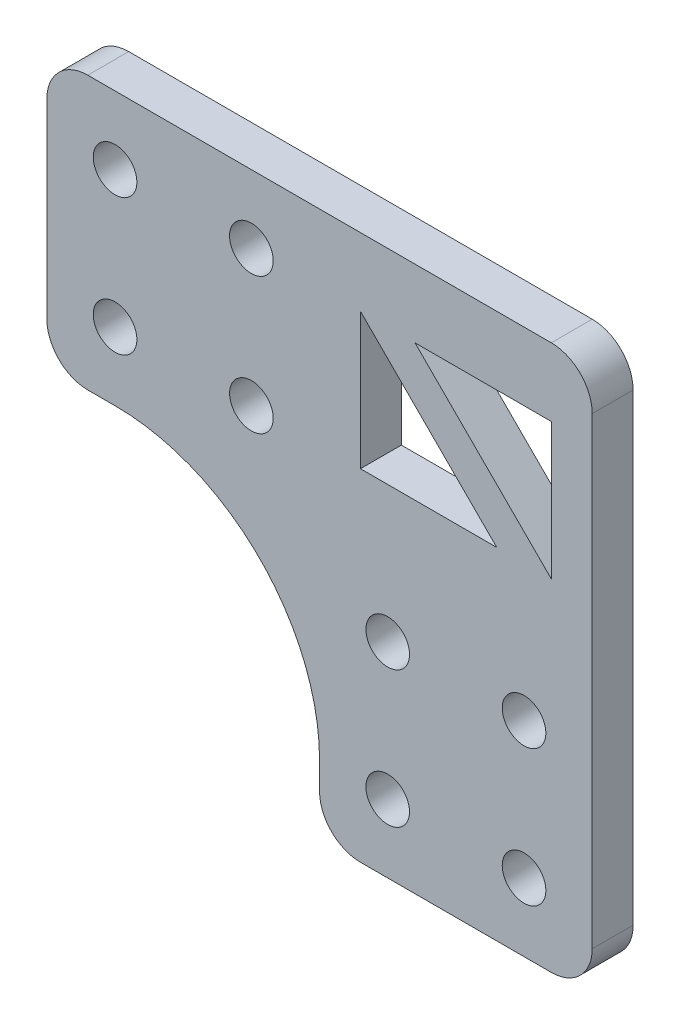
ISO-10303-21;
HEADER;
FILE_DESCRIPTION(('STEP AP214'),'2;1');
FILE_NAME('part.step','',(''),(''),'','','');
FILE_SCHEMA(('AUTOMOTIVE_DESIGN { 1 0 10303 214 1 1 1 1 }'));
ENDSEC;
DATA;
#1=APPLICATION_CONTEXT('core data for automotive mechanical design processes');
#2=APPLICATION_PROTOCOL_DEFINITION('international standard','automotive_design',2000,#1);
#3=PRODUCT_CONTEXT('',#1,'mechanical');
#4=PRODUCT('Part','Part','',(#3));
#5=PRODUCT_RELATED_PRODUCT_CATEGORY('part','',(#4));
#6=PRODUCT_DEFINITION_FORMATION('','',#4);
#7=PRODUCT_DEFINITION_CONTEXT('part definition',#1,'design');
#8=PRODUCT_DEFINITION('design','',#6,#7);
#9=PRODUCT_DEFINITION_SHAPE('','',#8);
#10=(LENGTH_UNIT() NAMED_UNIT(*) SI_UNIT(.MILLI.,.METRE.));
#11=(NAMED_UNIT(*) PLANE_ANGLE_UNIT() SI_UNIT($,.RADIAN.));
#12=(NAMED_UNIT(*) SI_UNIT($,.STERADIAN.) SOLID_ANGLE_UNIT());
#13=UNCERTAINTY_MEASURE_WITH_UNIT(LENGTH_MEASURE(1.E-05),#10,'distance_accuracy_value','');
#14=(GEOMETRIC_REPRESENTATION_CONTEXT(3) GLOBAL_UNCERTAINTY_ASSIGNED_CONTEXT((#13)) GLOBAL_UNIT_ASSIGNED_CONTEXT((#10,
#11,#12)) REPRESENTATION_CONTEXT('',''));
#15=CARTESIAN_POINT('',(0.,0.,0.));
#16=DIRECTION('',(0.,0.,1.));
#17=DIRECTION('',(1.,0.,0.));
#18=AXIS2_PLACEMENT_3D('',#15,#16,#17);
#19=CARTESIAN_POINT('',(0.,0.,3.));
#20=DIRECTION('',(0.,0.,-1.));
#21=DIRECTION('',(-1.,0.,0.));
#22=AXIS2_PLACEMENT_3D('',#19,#20,#21);
#23=PLANE('',#22);
#24=DIRECTION('',(-0.707106781186548,0.707106781186548,0.));
#25=VECTOR('',#24,1.);
#26=CARTESIAN_POINT('',(33.,-15.,3.));
#27=LINE('',#26,#25);
#28=CARTESIAN_POINT('',(33.,-15.,3.));
#29=VERTEX_POINT('',#28);
#30=CARTESIAN_POINT('',(23.,-5.,3.));
#31=VERTEX_POINT('',#30);
#32=EDGE_CURVE('E211',#29,#31,#27,.T.);
#33=ORIENTED_EDGE('',*,*,#32,.F.);
#34=DIRECTION('',(1.,0.,0.));
#35=VECTOR('',#34,1.);
#36=CARTESIAN_POINT('',(23.,-15.,3.));
#37=LINE('',#36,#35);
#38=CARTESIAN_POINT('',(23.,-15.,3.));
#39=VERTEX_POINT('',#38);
#40=EDGE_CURVE('E219',#39,#29,#37,.T.);
#41=ORIENTED_EDGE('',*,*,#40,.F.);
#42=DIRECTION('',(0.,-1.,0.));
#43=VECTOR('',#42,1.);
#44=CARTESIAN_POINT('',(23.,-5.,3.));
#45=LINE('',#44,#43);
#46=EDGE_CURVE('E214',#31,#39,#45,.T.);
#47=ORIENTED_EDGE('',*,*,#46,.F.);
#48=EDGE_LOOP('',(#33,#41,#47));
#49=FACE_BOUND('',#48,.T.);
#50=DIRECTION('',(1.,0.,0.));
#51=VECTOR('',#50,1.);
#52=CARTESIAN_POINT('',(40.,-40.,3.));
#53=LINE('',#52,#51);
#54=CARTESIAN_POINT('',(23.,-40.,3.));
#55=VERTEX_POINT('',#54);
#56=CARTESIAN_POINT('',(37.,-40.,3.));
#57=VERTEX_POINT('',#56);
#58=EDGE_CURVE('E319',#55,#57,#53,.T.);
#59=ORIENTED_EDGE('',*,*,#58,.T.);
#60=CARTESIAN_POINT('',(37.,-37.,3.));
#61=DIRECTION('',(0.,0.,-1.));
#62=DIRECTION('',(-1.,0.,0.));
#63=AXIS2_PLACEMENT_3D('',#60,#61,#62);
#64=CIRCLE('',#63,3.);
#65=CARTESIAN_POINT('',(40.,-37.,3.));
#66=VERTEX_POINT('',#65);
#67=EDGE_CURVE('E393',#57,#66,#64,.F.);
#68=ORIENTED_EDGE('',*,*,#67,.T.);
#69=DIRECTION('',(0.,1.,0.));
#70=VECTOR('',#69,1.);
#71=CARTESIAN_POINT('',(40.,0.,3.));
#72=LINE('',#71,#70);
#73=CARTESIAN_POINT('',(40.,-3.,3.));
#74=VERTEX_POINT('',#73);
#75=EDGE_CURVE('E323',#66,#74,#72,.T.);
#76=ORIENTED_EDGE('',*,*,#75,.T.);
#77=CARTESIAN_POINT('',(37.,-3.,3.));
#78=DIRECTION('',(0.,0.,-1.));
#79=DIRECTION('',(-1.,0.,0.));
#80=AXIS2_PLACEMENT_3D('',#77,#78,#79);
#81=CIRCLE('',#80,3.);
#82=CARTESIAN_POINT('',(37.,0.,3.));
#83=VERTEX_POINT('',#82);
#84=EDGE_CURVE('E390',#74,#83,#81,.F.);
#85=ORIENTED_EDGE('',*,*,#84,.T.);
#86=DIRECTION('',(-1.,0.,0.));
#87=VECTOR('',#86,1.);
#88=CARTESIAN_POINT('',(0.,0.,3.));
#89=LINE('',#88,#87);
#90=CARTESIAN_POINT('',(3.,0.,3.));
#91=VERTEX_POINT('',#90);
#92=EDGE_CURVE('E327',#83,#91,#89,.T.);
#93=ORIENTED_EDGE('',*,*,#92,.T.);
#94=CARTESIAN_POINT('',(3.,-3.,3.));
#95=DIRECTION('',(0.,0.,-1.));
#96=DIRECTION('',(-1.,0.,0.));
#97=AXIS2_PLACEMENT_3D('',#94,#95,#96);
#98=CIRCLE('',#97,3.);
#99=CARTESIAN_POINT('',(0.,-3.,3.));
#100=VERTEX_POINT('',#99);
#101=EDGE_CURVE('E381',#91,#100,#98,.F.);
#102=ORIENTED_EDGE('',*,*,#101,.T.);
#103=DIRECTION('',(0.,-1.,0.));
#104=VECTOR('',#103,1.);
#105=CARTESIAN_POINT('',(0.,-20.,3.));
#106=LINE('',#105,#104);
#107=CARTESIAN_POINT('',(0.,-17.,3.));
#108=VERTEX_POINT('',#107);
#109=EDGE_CURVE('E308',#100,#108,#106,.T.);
#110=ORIENTED_EDGE('',*,*,#109,.T.);
#111=CARTESIAN_POINT('',(3.,-17.,3.));
#112=DIRECTION('',(0.,0.,-1.));
#113=DIRECTION('',(-1.,0.,0.));
#114=AXIS2_PLACEMENT_3D('',#111,#112,#113);
#115=CIRCLE('',#114,3.);
#116=CARTESIAN_POINT('',(3.,-20.,3.));
#117=VERTEX_POINT('',#116);
#118=EDGE_CURVE('E384',#108,#117,#115,.F.);
#119=ORIENTED_EDGE('',*,*,#118,.T.);
#120=DIRECTION('',(1.,0.,0.));
#121=VECTOR('',#120,1.);
#122=CARTESIAN_POINT('',(0.,-20.,3.));
#123=LINE('',#122,#121);
#124=CARTESIAN_POINT('',(5.00000000000001,-20.,3.));
#125=VERTEX_POINT('',#124);
#126=EDGE_CURVE('E312',#117,#125,#123,.T.);
#127=ORIENTED_EDGE('',*,*,#126,.T.);
#128=CARTESIAN_POINT('',(5.00000000000001,-35.,3.));
#129=DIRECTION('',(0.,0.,-1.));
#130=DIRECTION('',(-1.,0.,0.));
#131=AXIS2_PLACEMENT_3D('',#128,#129,#130);
#132=CIRCLE('',#131,15.);
#133=CARTESIAN_POINT('',(20.,-35.,3.));
#134=VERTEX_POINT('',#133);
#135=EDGE_CURVE('E11',#125,#134,#132,.T.);
#136=ORIENTED_EDGE('',*,*,#135,.T.);
#137=DIRECTION('',(0.,-1.,0.));
#138=VECTOR('',#137,1.);
#139=CARTESIAN_POINT('',(20.,-20.,3.));
#140=LINE('',#139,#138);
#141=CARTESIAN_POINT('',(20.,-37.,3.));
#142=VERTEX_POINT('',#141);
#143=EDGE_CURVE('E316',#134,#142,#140,.T.);
#144=ORIENTED_EDGE('',*,*,#143,.T.);
#145=CARTESIAN_POINT('',(23.,-37.,3.));
#146=DIRECTION('',(0.,0.,-1.));
#147=DIRECTION('',(-1.,0.,0.));
#148=AXIS2_PLACEMENT_3D('',#145,#146,#147);
#149=CIRCLE('',#148,3.);
#150=EDGE_CURVE('E387',#142,#55,#149,.F.);
#151=ORIENTED_EDGE('',*,*,#150,.T.);
#152=EDGE_LOOP('',(#59,#68,#76,#85,#93,#102,#110,#119,#127,#136,#144,#151));
#153=FACE_BOUND('',#152,.T.);
#154=CARTESIAN_POINT('',(5.,-5.,3.));
#155=DIRECTION('',(0.,0.,1.));
#156=DIRECTION('',(1.,0.,0.));
#157=AXIS2_PLACEMENT_3D('',#154,#155,#156);
#158=CIRCLE('',#157,1.6);
#159=CARTESIAN_POINT('',(6.6,-5.,3.));
#160=VERTEX_POINT('',#159);
#161=EDGE_CURVE('E300',#160,#160,#158,.T.);
#162=ORIENTED_EDGE('',*,*,#161,.F.);
#163=EDGE_LOOP('',(#162));
#164=FACE_BOUND('',#163,.T.);
#165=CARTESIAN_POINT('',(15.,-5.,3.));
#166=DIRECTION('',(0.,0.,1.));
#167=DIRECTION('',(-1.,0.,0.));
#168=AXIS2_PLACEMENT_3D('',#165,#166,#167);
#169=CIRCLE('',#168,1.6);
#170=CARTESIAN_POINT('',(13.4,-5.,3.));
#171=VERTEX_POINT('',#170);
#172=EDGE_CURVE('E292',#171,#171,#169,.T.);
#173=ORIENTED_EDGE('',*,*,#172,.F.);
#174=EDGE_LOOP('',(#173));
#175=FACE_BOUND('',#174,.T.);
#176=CARTESIAN_POINT('',(15.,-15.,3.));
#177=DIRECTION('',(0.,0.,1.));
#178=DIRECTION('',(1.,0.,0.));
#179=AXIS2_PLACEMENT_3D('',#176,#177,#178);
#180=CIRCLE('',#179,1.6);
#181=CARTESIAN_POINT('',(16.6,-15.,3.));
#182=VERTEX_POINT('',#181);
#183=EDGE_CURVE('E284',#182,#182,#180,.T.);
#184=ORIENTED_EDGE('',*,*,#183,.F.);
#185=EDGE_LOOP('',(#184));
#186=FACE_BOUND('',#185,.T.);
#187=CARTESIAN_POINT('',(5.,-15.,3.));
#188=DIRECTION('',(0.,0.,1.));
#189=DIRECTION('',(-1.,0.,0.));
#190=AXIS2_PLACEMENT_3D('',#187,#188,#189);
#191=CIRCLE('',#190,1.6);
#192=CARTESIAN_POINT('',(3.4,-15.,3.));
#193=VERTEX_POINT('',#192);
#194=EDGE_CURVE('E276',#193,#193,#191,.T.);
#195=ORIENTED_EDGE('',*,*,#194,.F.);
#196=EDGE_LOOP('',(#195));
#197=FACE_BOUND('',#196,.T.);
#198=CARTESIAN_POINT('',(25.,-35.,3.));
#199=DIRECTION('',(0.,0.,1.));
#200=DIRECTION('',(1.,0.,0.));
#201=AXIS2_PLACEMENT_3D('',#198,#199,#200);
#202=CIRCLE('',#201,1.6);
#203=CARTESIAN_POINT('',(26.6,-35.,3.));
#204=VERTEX_POINT('',#203);
#205=EDGE_CURVE('E268',#204,#204,#202,.T.);
#206=ORIENTED_EDGE('',*,*,#205,.F.);
#207=EDGE_LOOP('',(#206));
#208=FACE_BOUND('',#207,.T.);
#209=CARTESIAN_POINT('',(35.,-35.,3.));
#210=DIRECTION('',(0.,0.,1.));
#211=DIRECTION('',(-1.,0.,0.));
#212=AXIS2_PLACEMENT_3D('',#209,#210,#211);
#213=CIRCLE('',#212,1.60000000000001);
#214=CARTESIAN_POINT('',(33.4,-35.,3.));
#215=VERTEX_POINT('',#214);
#216=EDGE_CURVE('E260',#215,#215,#213,.T.);
#217=ORIENTED_EDGE('',*,*,#216,.F.);
#218=EDGE_LOOP('',(#217));
#219=FACE_BOUND('',#218,.T.);
#220=CARTESIAN_POINT('',(35.,-25.,3.));
#221=DIRECTION('',(0.,0.,1.));
#222=DIRECTION('',(1.,0.,0.));
#223=AXIS2_PLACEMENT_3D('',#220,#221,#222);
#224=CIRCLE('',#223,1.6);
#225=CARTESIAN_POINT('',(36.6,-25.,3.));
#226=VERTEX_POINT('',#225);
#227=EDGE_CURVE('E252',#226,#226,#224,.T.);
#228=ORIENTED_EDGE('',*,*,#227,.F.);
#229=EDGE_LOOP('',(#228));
#230=FACE_BOUND('',#229,.T.);
#231=CARTESIAN_POINT('',(25.,-25.,3.));
#232=DIRECTION('',(0.,0.,1.));
#233=DIRECTION('',(-1.,0.,0.));
#234=AXIS2_PLACEMENT_3D('',#231,#232,#233);
#235=CIRCLE('',#234,1.6);
#236=CARTESIAN_POINT('',(23.4,-25.,3.));
#237=VERTEX_POINT('',#236);
#238=EDGE_CURVE('E244',#237,#237,#235,.T.);
#239=ORIENTED_EDGE('',*,*,#238,.F.);
#240=EDGE_LOOP('',(#239));
#241=FACE_BOUND('',#240,.T.);
#242=DIRECTION('',(0.707106781186547,-0.707106781186548,0.));
#243=VECTOR('',#242,1.);
#244=CARTESIAN_POINT('',(37.,-15.,3.));
#245=LINE('',#244,#243);
#246=CARTESIAN_POINT('',(27.,-5.,3.));
#247=VERTEX_POINT('',#246);
#248=CARTESIAN_POINT('',(37.,-15.,3.));
#249=VERTEX_POINT('',#248);
#250=EDGE_CURVE('E170',#247,#249,#245,.T.);
#251=ORIENTED_EDGE('',*,*,#250,.F.);
#252=DIRECTION('',(-1.,0.,0.));
#253=VECTOR('',#252,1.);
#254=CARTESIAN_POINT('',(27.,-5.,3.));
#255=LINE('',#254,#253);
#256=CARTESIAN_POINT('',(37.,-5.,3.));
#257=VERTEX_POINT('',#256);
#258=EDGE_CURVE('E193',#257,#247,#255,.T.);
#259=ORIENTED_EDGE('',*,*,#258,.F.);
#260=DIRECTION('',(0.,1.,0.));
#261=VECTOR('',#260,1.);
#262=CARTESIAN_POINT('',(37.,-5.,3.));
#263=LINE('',#262,#261);
#264=EDGE_CURVE('E181',#249,#257,#263,.T.);
#265=ORIENTED_EDGE('',*,*,#264,.F.);
#266=EDGE_LOOP('',(#251,#259,#265));
#267=FACE_BOUND('',#266,.T.);
#268=ADVANCED_FACE('F43',(#49,#153,#164,#175,#186,#197,#208,#219,#230,#241,#267),#23,.F.);
#269=CARTESIAN_POINT('',(0.,0.,0.));
#270=DIRECTION('',(0.,0.,-1.));
#271=DIRECTION('',(-1.,0.,0.));
#272=AXIS2_PLACEMENT_3D('',#269,#270,#271);
#273=PLANE('',#272);
#274=CARTESIAN_POINT('',(35.,-25.,0.));
#275=DIRECTION('',(0.,0.,1.));
#276=DIRECTION('',(1.,0.,0.));
#277=AXIS2_PLACEMENT_3D('',#274,#275,#276);
#278=CIRCLE('',#277,1.6);
#279=CARTESIAN_POINT('',(36.6,-25.,0.));
#280=VERTEX_POINT('',#279);
#281=EDGE_CURVE('E248',#280,#280,#278,.T.);
#282=ORIENTED_EDGE('',*,*,#281,.T.);
#283=EDGE_LOOP('',(#282));
#284=FACE_BOUND('',#283,.T.);
#285=CARTESIAN_POINT('',(25.,-35.,0.));
#286=DIRECTION('',(0.,0.,1.));
#287=DIRECTION('',(1.,0.,0.));
#288=AXIS2_PLACEMENT_3D('',#285,#286,#287);
#289=CIRCLE('',#288,1.6);
#290=CARTESIAN_POINT('',(26.6,-35.,0.));
#291=VERTEX_POINT('',#290);
#292=EDGE_CURVE('E264',#291,#291,#289,.T.);
#293=ORIENTED_EDGE('',*,*,#292,.T.);
#294=EDGE_LOOP('',(#293));
#295=FACE_BOUND('',#294,.T.);
#296=CARTESIAN_POINT('',(15.,-15.,0.));
#297=DIRECTION('',(0.,0.,1.));
#298=DIRECTION('',(1.,0.,0.));
#299=AXIS2_PLACEMENT_3D('',#296,#297,#298);
#300=CIRCLE('',#299,1.6);
#301=CARTESIAN_POINT('',(16.6,-15.,0.));
#302=VERTEX_POINT('',#301);
#303=EDGE_CURVE('E280',#302,#302,#300,.T.);
#304=ORIENTED_EDGE('',*,*,#303,.T.);
#305=EDGE_LOOP('',(#304));
#306=FACE_BOUND('',#305,.T.);
#307=CARTESIAN_POINT('',(5.,-5.,0.));
#308=DIRECTION('',(0.,0.,1.));
#309=DIRECTION('',(1.,0.,0.));
#310=AXIS2_PLACEMENT_3D('',#307,#308,#309);
#311=CIRCLE('',#310,1.6);
#312=CARTESIAN_POINT('',(6.6,-5.,0.));
#313=VERTEX_POINT('',#312);
#314=EDGE_CURVE('E296',#313,#313,#311,.T.);
#315=ORIENTED_EDGE('',*,*,#314,.T.);
#316=EDGE_LOOP('',(#315));
#317=FACE_BOUND('',#316,.T.);
#318=DIRECTION('',(0.,1.,0.));
#319=VECTOR('',#318,1.);
#320=CARTESIAN_POINT('',(40.,0.,0.));
#321=LINE('',#320,#319);
#322=CARTESIAN_POINT('',(40.,-37.,0.));
#323=VERTEX_POINT('',#322);
#324=CARTESIAN_POINT('',(40.,-3.,0.));
#325=VERTEX_POINT('',#324);
#326=EDGE_CURVE('E345',#323,#325,#321,.T.);
#327=ORIENTED_EDGE('',*,*,#326,.F.);
#328=CARTESIAN_POINT('',(37.,-37.,0.));
#329=DIRECTION('',(0.,0.,-1.));
#330=DIRECTION('',(-1.,0.,0.));
#331=AXIS2_PLACEMENT_3D('',#328,#329,#330);
#332=CIRCLE('',#331,3.);
#333=CARTESIAN_POINT('',(37.,-40.,0.));
#334=VERTEX_POINT('',#333);
#335=EDGE_CURVE('E371',#323,#334,#332,.T.);
#336=ORIENTED_EDGE('',*,*,#335,.T.);
#337=DIRECTION('',(1.,0.,0.));
#338=VECTOR('',#337,1.);
#339=CARTESIAN_POINT('',(40.,-40.,0.));
#340=LINE('',#339,#338);
#341=CARTESIAN_POINT('',(23.,-40.,0.));
#342=VERTEX_POINT('',#341);
#343=EDGE_CURVE('E341',#342,#334,#340,.T.);
#344=ORIENTED_EDGE('',*,*,#343,.F.);
#345=CARTESIAN_POINT('',(23.,-37.,0.));
#346=DIRECTION('',(0.,0.,-1.));
#347=DIRECTION('',(-1.,0.,0.));
#348=AXIS2_PLACEMENT_3D('',#345,#346,#347);
#349=CIRCLE('',#348,3.);
#350=CARTESIAN_POINT('',(20.,-37.,0.));
#351=VERTEX_POINT('',#350);
#352=EDGE_CURVE('E364',#342,#351,#349,.T.);
#353=ORIENTED_EDGE('',*,*,#352,.T.);
#354=DIRECTION('',(0.,-1.,0.));
#355=VECTOR('',#354,1.);
#356=CARTESIAN_POINT('',(20.,-20.,0.));
#357=LINE('',#356,#355);
#358=CARTESIAN_POINT('',(20.,-35.,0.));
#359=VERTEX_POINT('',#358);
#360=EDGE_CURVE('E338',#359,#351,#357,.T.);
#361=ORIENTED_EDGE('',*,*,#360,.F.);
#362=CARTESIAN_POINT('',(5.00000000000001,-35.,0.));
#363=DIRECTION('',(0.,0.,-1.));
#364=DIRECTION('',(-1.,0.,0.));
#365=AXIS2_PLACEMENT_3D('',#362,#363,#364);
#366=CIRCLE('',#365,15.);
#367=CARTESIAN_POINT('',(5.00000000000001,-20.,0.));
#368=VERTEX_POINT('',#367);
#369=EDGE_CURVE('E52',#359,#368,#366,.F.);
#370=ORIENTED_EDGE('',*,*,#369,.T.);
#371=DIRECTION('',(1.,0.,0.));
#372=VECTOR('',#371,1.);
#373=CARTESIAN_POINT('',(0.,-20.,0.));
#374=LINE('',#373,#372);
#375=CARTESIAN_POINT('',(3.,-20.,0.));
#376=VERTEX_POINT('',#375);
#377=EDGE_CURVE('E335',#376,#368,#374,.T.);
#378=ORIENTED_EDGE('',*,*,#377,.F.);
#379=CARTESIAN_POINT('',(3.,-17.,0.));
#380=DIRECTION('',(0.,0.,-1.));
#381=DIRECTION('',(-1.,0.,0.));
#382=AXIS2_PLACEMENT_3D('',#379,#380,#381);
#383=CIRCLE('',#382,3.);
#384=CARTESIAN_POINT('',(0.,-17.,0.));
#385=VERTEX_POINT('',#384);
#386=EDGE_CURVE('E361',#376,#385,#383,.T.);
#387=ORIENTED_EDGE('',*,*,#386,.T.);
#388=DIRECTION('',(0.,-1.,0.));
#389=VECTOR('',#388,1.);
#390=CARTESIAN_POINT('',(0.,-20.,0.));
#391=LINE('',#390,#389);
#392=CARTESIAN_POINT('',(0.,-3.,0.));
#393=VERTEX_POINT('',#392);
#394=EDGE_CURVE('E304',#393,#385,#391,.T.);
#395=ORIENTED_EDGE('',*,*,#394,.F.);
#396=CARTESIAN_POINT('',(3.,-3.,0.));
#397=DIRECTION('',(0.,0.,-1.));
#398=DIRECTION('',(-1.,0.,0.));
#399=AXIS2_PLACEMENT_3D('',#396,#397,#398);
#400=CIRCLE('',#399,3.);
#401=CARTESIAN_POINT('',(3.,0.,0.));
#402=VERTEX_POINT('',#401);
#403=EDGE_CURVE('E358',#393,#402,#400,.T.);
#404=ORIENTED_EDGE('',*,*,#403,.T.);
#405=DIRECTION('',(-1.,0.,0.));
#406=VECTOR('',#405,1.);
#407=CARTESIAN_POINT('',(0.,0.,0.));
#408=LINE('',#407,#406);
#409=CARTESIAN_POINT('',(37.,0.,0.));
#410=VERTEX_POINT('',#409);
#411=EDGE_CURVE('E313',#410,#402,#408,.T.);
#412=ORIENTED_EDGE('',*,*,#411,.F.);
#413=CARTESIAN_POINT('',(37.,-3.,0.));
#414=DIRECTION('',(0.,0.,-1.));
#415=DIRECTION('',(-1.,0.,0.));
#416=AXIS2_PLACEMENT_3D('',#413,#414,#415);
#417=CIRCLE('',#416,3.);
#418=EDGE_CURVE('E368',#410,#325,#417,.T.);
#419=ORIENTED_EDGE('',*,*,#418,.T.);
#420=EDGE_LOOP('',(#327,#336,#344,#353,#361,#370,#378,#387,#395,#404,#412,#419));
#421=FACE_BOUND('',#420,.T.);
#422=CARTESIAN_POINT('',(15.,-5.,0.));
#423=DIRECTION('',(0.,0.,1.));
#424=DIRECTION('',(-1.,0.,0.));
#425=AXIS2_PLACEMENT_3D('',#422,#423,#424);
#426=CIRCLE('',#425,1.6);
#427=CARTESIAN_POINT('',(13.4,-5.,0.));
#428=VERTEX_POINT('',#427);
#429=EDGE_CURVE('E288',#428,#428,#426,.T.);
#430=ORIENTED_EDGE('',*,*,#429,.T.);
#431=EDGE_LOOP('',(#430));
#432=FACE_BOUND('',#431,.T.);
#433=CARTESIAN_POINT('',(5.,-15.,0.));
#434=DIRECTION('',(0.,0.,1.));
#435=DIRECTION('',(-1.,0.,0.));
#436=AXIS2_PLACEMENT_3D('',#433,#434,#435);
#437=CIRCLE('',#436,1.6);
#438=CARTESIAN_POINT('',(3.4,-15.,0.));
#439=VERTEX_POINT('',#438);
#440=EDGE_CURVE('E272',#439,#439,#437,.T.);
#441=ORIENTED_EDGE('',*,*,#440,.T.);
#442=EDGE_LOOP('',(#441));
#443=FACE_BOUND('',#442,.T.);
#444=CARTESIAN_POINT('',(35.,-35.,0.));
#445=DIRECTION('',(0.,0.,1.));
#446=DIRECTION('',(-1.,0.,0.));
#447=AXIS2_PLACEMENT_3D('',#444,#445,#446);
#448=CIRCLE('',#447,1.60000000000001);
#449=CARTESIAN_POINT('',(33.4,-35.,0.));
#450=VERTEX_POINT('',#449);
#451=EDGE_CURVE('E256',#450,#450,#448,.T.);
#452=ORIENTED_EDGE('',*,*,#451,.T.);
#453=EDGE_LOOP('',(#452));
#454=FACE_BOUND('',#453,.T.);
#455=CARTESIAN_POINT('',(25.,-25.,0.));
#456=DIRECTION('',(0.,0.,1.));
#457=DIRECTION('',(-1.,0.,0.));
#458=AXIS2_PLACEMENT_3D('',#455,#456,#457);
#459=CIRCLE('',#458,1.6);
#460=CARTESIAN_POINT('',(23.4,-25.,0.));
#461=VERTEX_POINT('',#460);
#462=EDGE_CURVE('E243',#461,#461,#459,.T.);
#463=ORIENTED_EDGE('',*,*,#462,.T.);
#464=EDGE_LOOP('',(#463));
#465=FACE_BOUND('',#464,.T.);
#466=DIRECTION('',(1.,0.,0.));
#467=VECTOR('',#466,1.);
#468=CARTESIAN_POINT('',(23.,-15.,0.));
#469=LINE('',#468,#467);
#470=CARTESIAN_POINT('',(23.,-15.,0.));
#471=VERTEX_POINT('',#470);
#472=CARTESIAN_POINT('',(33.,-15.,0.));
#473=VERTEX_POINT('',#472);
#474=EDGE_CURVE('E215',#471,#473,#469,.T.);
#475=ORIENTED_EDGE('',*,*,#474,.T.);
#476=DIRECTION('',(-0.707106781186548,0.707106781186548,0.));
#477=VECTOR('',#476,1.);
#478=CARTESIAN_POINT('',(33.,-15.,0.));
#479=LINE('',#478,#477);
#480=CARTESIAN_POINT('',(23.,-5.,0.));
#481=VERTEX_POINT('',#480);
#482=EDGE_CURVE('E190',#473,#481,#479,.T.);
#483=ORIENTED_EDGE('',*,*,#482,.T.);
#484=DIRECTION('',(0.,-1.,0.));
#485=VECTOR('',#484,1.);
#486=CARTESIAN_POINT('',(23.,-5.,0.));
#487=LINE('',#486,#485);
#488=EDGE_CURVE('E226',#481,#471,#487,.T.);
#489=ORIENTED_EDGE('',*,*,#488,.T.);
#490=EDGE_LOOP('',(#475,#483,#489));
#491=FACE_BOUND('',#490,.T.);
#492=DIRECTION('',(-1.,0.,0.));
#493=VECTOR('',#492,1.);
#494=CARTESIAN_POINT('',(27.,-5.,0.));
#495=LINE('',#494,#493);
#496=CARTESIAN_POINT('',(37.,-5.,0.));
#497=VERTEX_POINT('',#496);
#498=CARTESIAN_POINT('',(27.,-5.,0.));
#499=VERTEX_POINT('',#498);
#500=EDGE_CURVE('E182',#497,#499,#495,.T.);
#501=ORIENTED_EDGE('',*,*,#500,.T.);
#502=DIRECTION('',(0.707106781186547,-0.707106781186548,0.));
#503=VECTOR('',#502,1.);
#504=CARTESIAN_POINT('',(37.,-15.,0.));
#505=LINE('',#504,#503);
#506=CARTESIAN_POINT('',(37.,-15.,0.));
#507=VERTEX_POINT('',#506);
#508=EDGE_CURVE('E199',#499,#507,#505,.T.);
#509=ORIENTED_EDGE('',*,*,#508,.T.);
#510=DIRECTION('',(0.,1.,0.));
#511=VECTOR('',#510,1.);
#512=CARTESIAN_POINT('',(37.,-5.,0.));
#513=LINE('',#512,#511);
#514=EDGE_CURVE('E188',#507,#497,#513,.T.);
#515=ORIENTED_EDGE('',*,*,#514,.T.);
#516=EDGE_LOOP('',(#501,#509,#515));
#517=FACE_BOUND('',#516,.T.);
#518=ADVANCED_FACE('F431',(#284,#295,#306,#317,#421,#432,#443,#454,#465,#491,#517),#273,.T.);
#519=CARTESIAN_POINT('',(0.,-20.,3.));
#520=DIRECTION('',(1.,0.,0.));
#521=DIRECTION('',(0.,0.,-1.));
#522=AXIS2_PLACEMENT_3D('',#519,#520,#521);
#523=PLANE('',#522);
#524=ORIENTED_EDGE('',*,*,#394,.T.);
#525=DIRECTION('',(0.,0.,-1.));
#526=VECTOR('',#525,1.);
#527=CARTESIAN_POINT('',(0.,-17.,3.));
#528=LINE('',#527,#526);
#529=EDGE_CURVE('E415',#385,#108,#528,.F.);
#530=ORIENTED_EDGE('',*,*,#529,.T.);
#531=ORIENTED_EDGE('',*,*,#109,.F.);
#532=DIRECTION('',(0.,0.,-1.));
#533=VECTOR('',#532,1.);
#534=CARTESIAN_POINT('',(0.,-3.,3.));
#535=LINE('',#534,#533);
#536=EDGE_CURVE('E411',#100,#393,#535,.T.);
#537=ORIENTED_EDGE('',*,*,#536,.T.);
#538=EDGE_LOOP('',(#524,#530,#531,#537));
#539=FACE_BOUND('',#538,.T.);
#540=ADVANCED_FACE('F469',(#539),#523,.F.);
#541=CARTESIAN_POINT('',(0.,-20.,3.));
#542=DIRECTION('',(0.,1.,0.));
#543=DIRECTION('',(0.,0.,1.));
#544=AXIS2_PLACEMENT_3D('',#541,#542,#543);
#545=PLANE('',#544);
#546=ORIENTED_EDGE('',*,*,#377,.T.);
#547=DIRECTION('',(0.,0.,-1.));
#548=VECTOR('',#547,1.);
#549=CARTESIAN_POINT('',(5.00000000000001,-20.,3.));
#550=LINE('',#549,#548);
#551=EDGE_CURVE('E65',#368,#125,#550,.F.);
#552=ORIENTED_EDGE('',*,*,#551,.T.);
#553=ORIENTED_EDGE('',*,*,#126,.F.);
#554=DIRECTION('',(0.,0.,-1.));
#555=VECTOR('',#554,1.);
#556=CARTESIAN_POINT('',(3.,-20.,3.));
#557=LINE('',#556,#555);
#558=EDGE_CURVE('E407',#117,#376,#557,.T.);
#559=ORIENTED_EDGE('',*,*,#558,.T.);
#560=EDGE_LOOP('',(#546,#552,#553,#559));
#561=FACE_BOUND('',#560,.T.);
#562=ADVANCED_FACE('F475',(#561),#545,.F.);
#563=CARTESIAN_POINT('',(20.,-20.,3.));
#564=DIRECTION('',(1.,0.,0.));
#565=DIRECTION('',(0.,0.,-1.));
#566=AXIS2_PLACEMENT_3D('',#563,#564,#565);
#567=PLANE('',#566);
#568=ORIENTED_EDGE('',*,*,#143,.F.);
#569=DIRECTION('',(0.,0.,-1.));
#570=VECTOR('',#569,1.);
#571=CARTESIAN_POINT('',(20.,-35.,0.));
#572=LINE('',#571,#570);
#573=EDGE_CURVE('E418',#134,#359,#572,.T.);
#574=ORIENTED_EDGE('',*,*,#573,.T.);
#575=ORIENTED_EDGE('',*,*,#360,.T.);
#576=DIRECTION('',(0.,0.,-1.));
#577=VECTOR('',#576,1.);
#578=CARTESIAN_POINT('',(20.,-37.,3.));
#579=LINE('',#578,#577);
#580=EDGE_CURVE('E403',#351,#142,#579,.F.);
#581=ORIENTED_EDGE('',*,*,#580,.T.);
#582=EDGE_LOOP('',(#568,#574,#575,#581));
#583=FACE_BOUND('',#582,.T.);
#584=ADVANCED_FACE('F427',(#583),#567,.F.);
#585=CARTESIAN_POINT('',(40.,-40.,3.));
#586=DIRECTION('',(0.,1.,0.));
#587=DIRECTION('',(-1.,0.,0.));
#588=AXIS2_PLACEMENT_3D('',#585,#586,#587);
#589=PLANE('',#588);
#590=ORIENTED_EDGE('',*,*,#343,.T.);
#591=DIRECTION('',(0.,0.,-1.));
#592=VECTOR('',#591,1.);
#593=CARTESIAN_POINT('',(37.,-40.,3.));
#594=LINE('',#593,#592);
#595=EDGE_CURVE('E378',#334,#57,#594,.F.);
#596=ORIENTED_EDGE('',*,*,#595,.T.);
#597=ORIENTED_EDGE('',*,*,#58,.F.);
#598=DIRECTION('',(0.,0.,-1.));
#599=VECTOR('',#598,1.);
#600=CARTESIAN_POINT('',(23.,-40.,3.));
#601=LINE('',#600,#599);
#602=EDGE_CURVE('E374',#55,#342,#601,.T.);
#603=ORIENTED_EDGE('',*,*,#602,.T.);
#604=EDGE_LOOP('',(#590,#596,#597,#603));
#605=FACE_BOUND('',#604,.T.);
#606=ADVANCED_FACE('F444',(#605),#589,.F.);
#607=CARTESIAN_POINT('',(40.,0.,3.));
#608=DIRECTION('',(-1.,0.,0.));
#609=DIRECTION('',(0.,-1.,0.));
#610=AXIS2_PLACEMENT_3D('',#607,#608,#609);
#611=PLANE('',#610);
#612=ORIENTED_EDGE('',*,*,#75,.F.);
#613=DIRECTION('',(0.,0.,-1.));
#614=VECTOR('',#613,1.);
#615=CARTESIAN_POINT('',(40.,-37.,3.));
#616=LINE('',#615,#614);
#617=EDGE_CURVE('E354',#66,#323,#616,.T.);
#618=ORIENTED_EDGE('',*,*,#617,.T.);
#619=ORIENTED_EDGE('',*,*,#326,.T.);
#620=DIRECTION('',(0.,0.,-1.));
#621=VECTOR('',#620,1.);
#622=CARTESIAN_POINT('',(40.,-3.,3.));
#623=LINE('',#622,#621);
#624=EDGE_CURVE('E331',#325,#74,#623,.F.);
#625=ORIENTED_EDGE('',*,*,#624,.T.);
#626=EDGE_LOOP('',(#612,#618,#619,#625));
#627=FACE_BOUND('',#626,.T.);
#628=ADVANCED_FACE('F452',(#627),#611,.F.);
#629=CARTESIAN_POINT('',(0.,0.,3.));
#630=DIRECTION('',(0.,-1.,0.));
#631=DIRECTION('',(0.,0.,-1.));
#632=AXIS2_PLACEMENT_3D('',#629,#630,#631);
#633=PLANE('',#632);
#634=ORIENTED_EDGE('',*,*,#92,.F.);
#635=DIRECTION('',(0.,0.,-1.));
#636=VECTOR('',#635,1.);
#637=CARTESIAN_POINT('',(37.,0.,3.));
#638=LINE('',#637,#636);
#639=EDGE_CURVE('E399',#83,#410,#638,.T.);
#640=ORIENTED_EDGE('',*,*,#639,.T.);
#641=ORIENTED_EDGE('',*,*,#411,.T.);
#642=DIRECTION('',(0.,0.,-1.));
#643=VECTOR('',#642,1.);
#644=CARTESIAN_POINT('',(3.,0.,3.));
#645=LINE('',#644,#643);
#646=EDGE_CURVE('E396',#402,#91,#645,.F.);
#647=ORIENTED_EDGE('',*,*,#646,.T.);
#648=EDGE_LOOP('',(#634,#640,#641,#647));
#649=FACE_BOUND('',#648,.T.);
#650=ADVANCED_FACE('F460',(#649),#633,.F.);
#651=CARTESIAN_POINT('',(5.,-5.,3.));
#652=DIRECTION('',(0.,0.,-1.));
#653=DIRECTION('',(-1.,0.,0.));
#654=AXIS2_PLACEMENT_3D('',#651,#652,#653);
#655=CYLINDRICAL_SURFACE('',#654,1.6);
#656=ORIENTED_EDGE('',*,*,#161,.T.);
#657=EDGE_LOOP('',(#656));
#658=FACE_BOUND('',#657,.T.);
#659=ORIENTED_EDGE('',*,*,#314,.F.);
#660=EDGE_LOOP('',(#659));
#661=FACE_BOUND('',#660,.T.);
#662=ADVANCED_FACE('F490',(#658,#661),#655,.F.);
#663=CARTESIAN_POINT('',(15.,-5.,3.));
#664=DIRECTION('',(0.,0.,-1.));
#665=DIRECTION('',(-1.,0.,0.));
#666=AXIS2_PLACEMENT_3D('',#663,#664,#665);
#667=CYLINDRICAL_SURFACE('',#666,1.6);
#668=ORIENTED_EDGE('',*,*,#172,.T.);
#669=EDGE_LOOP('',(#668));
#670=FACE_BOUND('',#669,.T.);
#671=ORIENTED_EDGE('',*,*,#429,.F.);
#672=EDGE_LOOP('',(#671));
#673=FACE_BOUND('',#672,.T.);
#674=ADVANCED_FACE('F693',(#670,#673),#667,.F.);
#675=CARTESIAN_POINT('',(15.,-15.,3.));
#676=DIRECTION('',(0.,0.,-1.));
#677=DIRECTION('',(-1.,0.,0.));
#678=AXIS2_PLACEMENT_3D('',#675,#676,#677);
#679=CYLINDRICAL_SURFACE('',#678,1.6);
#680=ORIENTED_EDGE('',*,*,#183,.T.);
#681=EDGE_LOOP('',(#680));
#682=FACE_BOUND('',#681,.T.);
#683=ORIENTED_EDGE('',*,*,#303,.F.);
#684=EDGE_LOOP('',(#683));
#685=FACE_BOUND('',#684,.T.);
#686=ADVANCED_FACE('F683',(#682,#685),#679,.F.);
#687=CARTESIAN_POINT('',(5.,-15.,3.));
#688=DIRECTION('',(0.,0.,-1.));
#689=DIRECTION('',(-1.,0.,0.));
#690=AXIS2_PLACEMENT_3D('',#687,#688,#689);
#691=CYLINDRICAL_SURFACE('',#690,1.6);
#692=ORIENTED_EDGE('',*,*,#194,.T.);
#693=EDGE_LOOP('',(#692));
#694=FACE_BOUND('',#693,.T.);
#695=ORIENTED_EDGE('',*,*,#440,.F.);
#696=EDGE_LOOP('',(#695));
#697=FACE_BOUND('',#696,.T.);
#698=ADVANCED_FACE('F673',(#694,#697),#691,.F.);
#699=CARTESIAN_POINT('',(25.,-35.,3.));
#700=DIRECTION('',(0.,0.,-1.));
#701=DIRECTION('',(-1.,0.,0.));
#702=AXIS2_PLACEMENT_3D('',#699,#700,#701);
#703=CYLINDRICAL_SURFACE('',#702,1.6);
#704=ORIENTED_EDGE('',*,*,#205,.T.);
#705=EDGE_LOOP('',(#704));
#706=FACE_BOUND('',#705,.T.);
#707=ORIENTED_EDGE('',*,*,#292,.F.);
#708=EDGE_LOOP('',(#707));
#709=FACE_BOUND('',#708,.T.);
#710=ADVANCED_FACE('F663',(#706,#709),#703,.F.);
#711=CARTESIAN_POINT('',(35.,-35.,3.));
#712=DIRECTION('',(0.,0.,-1.));
#713=DIRECTION('',(-1.,0.,0.));
#714=AXIS2_PLACEMENT_3D('',#711,#712,#713);
#715=CYLINDRICAL_SURFACE('',#714,1.60000000000001);
#716=ORIENTED_EDGE('',*,*,#216,.T.);
#717=EDGE_LOOP('',(#716));
#718=FACE_BOUND('',#717,.T.);
#719=ORIENTED_EDGE('',*,*,#451,.F.);
#720=EDGE_LOOP('',(#719));
#721=FACE_BOUND('',#720,.T.);
#722=ADVANCED_FACE('F653',(#718,#721),#715,.F.);
#723=CARTESIAN_POINT('',(35.,-25.,3.));
#724=DIRECTION('',(0.,0.,-1.));
#725=DIRECTION('',(-1.,0.,0.));
#726=AXIS2_PLACEMENT_3D('',#723,#724,#725);
#727=CYLINDRICAL_SURFACE('',#726,1.6);
#728=ORIENTED_EDGE('',*,*,#227,.T.);
#729=EDGE_LOOP('',(#728));
#730=FACE_BOUND('',#729,.T.);
#731=ORIENTED_EDGE('',*,*,#281,.F.);
#732=EDGE_LOOP('',(#731));
#733=FACE_BOUND('',#732,.T.);
#734=ADVANCED_FACE('F643',(#730,#733),#727,.F.);
#735=CARTESIAN_POINT('',(25.,-25.,3.));
#736=DIRECTION('',(0.,0.,-1.));
#737=DIRECTION('',(-1.,0.,0.));
#738=AXIS2_PLACEMENT_3D('',#735,#736,#737);
#739=CYLINDRICAL_SURFACE('',#738,1.6);
#740=ORIENTED_EDGE('',*,*,#238,.T.);
#741=EDGE_LOOP('',(#740));
#742=FACE_BOUND('',#741,.T.);
#743=ORIENTED_EDGE('',*,*,#462,.F.);
#744=EDGE_LOOP('',(#743));
#745=FACE_BOUND('',#744,.T.);
#746=ADVANCED_FACE('F633',(#742,#745),#739,.F.);
#747=CARTESIAN_POINT('',(33.,-15.,3.));
#748=DIRECTION('',(-0.707106781186547,-0.707106781186547,0.));
#749=DIRECTION('',(0.707106781186548,-0.707106781186548,0.));
#750=AXIS2_PLACEMENT_3D('',#747,#748,#749);
#751=PLANE('',#750);
#752=ORIENTED_EDGE('',*,*,#482,.F.);
#753=DIRECTION('',(0.,0.,-1.));
#754=VECTOR('',#753,1.);
#755=CARTESIAN_POINT('',(33.,-15.,3.));
#756=LINE('',#755,#754);
#757=EDGE_CURVE('E222',#29,#473,#756,.T.);
#758=ORIENTED_EDGE('',*,*,#757,.F.);
#759=ORIENTED_EDGE('',*,*,#32,.T.);
#760=DIRECTION('',(0.,0.,-1.));
#761=VECTOR('',#760,1.);
#762=CARTESIAN_POINT('',(23.,-5.,3.));
#763=LINE('',#762,#761);
#764=EDGE_CURVE('E239',#31,#481,#763,.T.);
#765=ORIENTED_EDGE('',*,*,#764,.T.);
#766=EDGE_LOOP('',(#752,#758,#759,#765));
#767=FACE_BOUND('',#766,.T.);
#768=ADVANCED_FACE('F623',(#767),#751,.T.);
#769=CARTESIAN_POINT('',(23.,-5.,3.));
#770=DIRECTION('',(1.,0.,0.));
#771=DIRECTION('',(0.,0.,-1.));
#772=AXIS2_PLACEMENT_3D('',#769,#770,#771);
#773=PLANE('',#772);
#774=ORIENTED_EDGE('',*,*,#488,.F.);
#775=ORIENTED_EDGE('',*,*,#764,.F.);
#776=ORIENTED_EDGE('',*,*,#46,.T.);
#777=DIRECTION('',(0.,0.,-1.));
#778=VECTOR('',#777,1.);
#779=CARTESIAN_POINT('',(23.,-15.,3.));
#780=LINE('',#779,#778);
#781=EDGE_CURVE('E236',#39,#471,#780,.T.);
#782=ORIENTED_EDGE('',*,*,#781,.T.);
#783=EDGE_LOOP('',(#774,#775,#776,#782));
#784=FACE_BOUND('',#783,.T.);
#785=ADVANCED_FACE('F613',(#784),#773,.T.);
#786=CARTESIAN_POINT('',(23.,-15.,3.));
#787=DIRECTION('',(0.,1.,0.));
#788=DIRECTION('',(0.,0.,1.));
#789=AXIS2_PLACEMENT_3D('',#786,#787,#788);
#790=PLANE('',#789);
#791=ORIENTED_EDGE('',*,*,#474,.F.);
#792=ORIENTED_EDGE('',*,*,#781,.F.);
#793=ORIENTED_EDGE('',*,*,#40,.T.);
#794=ORIENTED_EDGE('',*,*,#757,.T.);
#795=EDGE_LOOP('',(#791,#792,#793,#794));
#796=FACE_BOUND('',#795,.T.);
#797=ADVANCED_FACE('F604',(#796),#790,.T.);
#798=CARTESIAN_POINT('',(37.,-15.,3.));
#799=DIRECTION('',(0.707106781186548,0.707106781186547,0.));
#800=DIRECTION('',(-0.707106781186547,0.707106781186548,0.));
#801=AXIS2_PLACEMENT_3D('',#798,#799,#800);
#802=PLANE('',#801);
#803=ORIENTED_EDGE('',*,*,#508,.F.);
#804=DIRECTION('',(0.,0.,-1.));
#805=VECTOR('',#804,1.);
#806=CARTESIAN_POINT('',(27.,-5.,3.));
#807=LINE('',#806,#805);
#808=EDGE_CURVE('E176',#247,#499,#807,.T.);
#809=ORIENTED_EDGE('',*,*,#808,.F.);
#810=ORIENTED_EDGE('',*,*,#250,.T.);
#811=DIRECTION('',(0.,0.,-1.));
#812=VECTOR('',#811,1.);
#813=CARTESIAN_POINT('',(37.,-15.,3.));
#814=LINE('',#813,#812);
#815=EDGE_CURVE('E173',#249,#507,#814,.T.);
#816=ORIENTED_EDGE('',*,*,#815,.T.);
#817=EDGE_LOOP('',(#803,#809,#810,#816));
#818=FACE_BOUND('',#817,.T.);
#819=ADVANCED_FACE('F172',(#818),#802,.T.);
#820=CARTESIAN_POINT('',(37.,-5.,3.));
#821=DIRECTION('',(-1.,0.,0.));
#822=DIRECTION('',(0.,0.,1.));
#823=AXIS2_PLACEMENT_3D('',#820,#821,#822);
#824=PLANE('',#823);
#825=ORIENTED_EDGE('',*,*,#514,.F.);
#826=ORIENTED_EDGE('',*,*,#815,.F.);
#827=ORIENTED_EDGE('',*,*,#264,.T.);
#828=DIRECTION('',(0.,0.,-1.));
#829=VECTOR('',#828,1.);
#830=CARTESIAN_POINT('',(37.,-5.,3.));
#831=LINE('',#830,#829);
#832=EDGE_CURVE('E191',#257,#497,#831,.T.);
#833=ORIENTED_EDGE('',*,*,#832,.T.);
#834=EDGE_LOOP('',(#825,#826,#827,#833));
#835=FACE_BOUND('',#834,.T.);
#836=ADVANCED_FACE('F186',(#835),#824,.T.);
#837=CARTESIAN_POINT('',(27.,-5.,3.));
#838=DIRECTION('',(0.,-1.,0.));
#839=DIRECTION('',(1.,0.,0.));
#840=AXIS2_PLACEMENT_3D('',#837,#838,#839);
#841=PLANE('',#840);
#842=ORIENTED_EDGE('',*,*,#500,.F.);
#843=ORIENTED_EDGE('',*,*,#832,.F.);
#844=ORIENTED_EDGE('',*,*,#258,.T.);
#845=ORIENTED_EDGE('',*,*,#808,.T.);
#846=EDGE_LOOP('',(#842,#843,#844,#845));
#847=FACE_BOUND('',#846,.T.);
#848=ADVANCED_FACE('F507',(#847),#841,.T.);
#849=CARTESIAN_POINT('',(37.,-37.,3.));
#850=DIRECTION('',(0.,0.,-1.));
#851=DIRECTION('',(-1.,0.,0.));
#852=AXIS2_PLACEMENT_3D('',#849,#850,#851);
#853=CYLINDRICAL_SURFACE('',#852,3.);
#854=ORIENTED_EDGE('',*,*,#67,.F.);
#855=ORIENTED_EDGE('',*,*,#595,.F.);
#856=ORIENTED_EDGE('',*,*,#335,.F.);
#857=ORIENTED_EDGE('',*,*,#617,.F.);
#858=EDGE_LOOP('',(#854,#855,#856,#857));
#859=FACE_BOUND('',#858,.T.);
#860=ADVANCED_FACE('F447',(#859),#853,.T.);
#861=CARTESIAN_POINT('',(37.,-3.,3.));
#862=DIRECTION('',(0.,0.,-1.));
#863=DIRECTION('',(-1.,0.,0.));
#864=AXIS2_PLACEMENT_3D('',#861,#862,#863);
#865=CYLINDRICAL_SURFACE('',#864,3.);
#866=ORIENTED_EDGE('',*,*,#84,.F.);
#867=ORIENTED_EDGE('',*,*,#624,.F.);
#868=ORIENTED_EDGE('',*,*,#418,.F.);
#869=ORIENTED_EDGE('',*,*,#639,.F.);
#870=EDGE_LOOP('',(#866,#867,#868,#869));
#871=FACE_BOUND('',#870,.T.);
#872=ADVANCED_FACE('F455',(#871),#865,.T.);
#873=CARTESIAN_POINT('',(23.,-37.,3.));
#874=DIRECTION('',(0.,0.,-1.));
#875=DIRECTION('',(-1.,0.,0.));
#876=AXIS2_PLACEMENT_3D('',#873,#874,#875);
#877=CYLINDRICAL_SURFACE('',#876,3.);
#878=ORIENTED_EDGE('',*,*,#150,.F.);
#879=ORIENTED_EDGE('',*,*,#580,.F.);
#880=ORIENTED_EDGE('',*,*,#352,.F.);
#881=ORIENTED_EDGE('',*,*,#602,.F.);
#882=EDGE_LOOP('',(#878,#879,#880,#881));
#883=FACE_BOUND('',#882,.T.);
#884=ADVANCED_FACE('F438',(#883),#877,.T.);
#885=CARTESIAN_POINT('',(3.,-17.,3.));
#886=DIRECTION('',(0.,0.,-1.));
#887=DIRECTION('',(-1.,0.,0.));
#888=AXIS2_PLACEMENT_3D('',#885,#886,#887);
#889=CYLINDRICAL_SURFACE('',#888,3.);
#890=ORIENTED_EDGE('',*,*,#118,.F.);
#891=ORIENTED_EDGE('',*,*,#529,.F.);
#892=ORIENTED_EDGE('',*,*,#386,.F.);
#893=ORIENTED_EDGE('',*,*,#558,.F.);
#894=EDGE_LOOP('',(#890,#891,#892,#893));
#895=FACE_BOUND('',#894,.T.);
#896=ADVANCED_FACE('F473',(#895),#889,.T.);
#897=CARTESIAN_POINT('',(3.,-3.,3.));
#898=DIRECTION('',(0.,0.,-1.));
#899=DIRECTION('',(-1.,0.,0.));
#900=AXIS2_PLACEMENT_3D('',#897,#898,#899);
#901=CYLINDRICAL_SURFACE('',#900,3.);
#902=ORIENTED_EDGE('',*,*,#101,.F.);
#903=ORIENTED_EDGE('',*,*,#646,.F.);
#904=ORIENTED_EDGE('',*,*,#403,.F.);
#905=ORIENTED_EDGE('',*,*,#536,.F.);
#906=EDGE_LOOP('',(#902,#903,#904,#905));
#907=FACE_BOUND('',#906,.T.);
#908=ADVANCED_FACE('F464',(#907),#901,.T.);
#909=CARTESIAN_POINT('',(5.00000000000001,-35.,3.));
#910=DIRECTION('',(0.,0.,1.));
#911=DIRECTION('',(1.,0.,0.));
#912=AXIS2_PLACEMENT_3D('',#909,#910,#911);
#913=CYLINDRICAL_SURFACE('',#912,15.);
#914=ORIENTED_EDGE('',*,*,#135,.F.);
#915=ORIENTED_EDGE('',*,*,#551,.F.);
#916=ORIENTED_EDGE('',*,*,#369,.F.);
#917=ORIENTED_EDGE('',*,*,#573,.F.);
#918=EDGE_LOOP('',(#914,#915,#916,#917));
#919=FACE_BOUND('',#918,.T.);
#920=ADVANCED_FACE('F45',(#919),#913,.F.);
#921=CLOSED_SHELL('',(#268,#518,#540,#562,#584,#606,#628,#650,#662,#674,#686,#698,#710,#722,
#734,#746,#768,#785,#797,#819,#836,#848,#860,#872,#884,#896,#908,#920));
#922=MANIFOLD_SOLID_BREP('B2',#921);
#923=ADVANCED_BREP_SHAPE_REPRESENTATION('',(#18,#922),#14);
#924=SHAPE_DEFINITION_REPRESENTATION(#9,#923);
ENDSEC;
END-ISO-10303-21;
